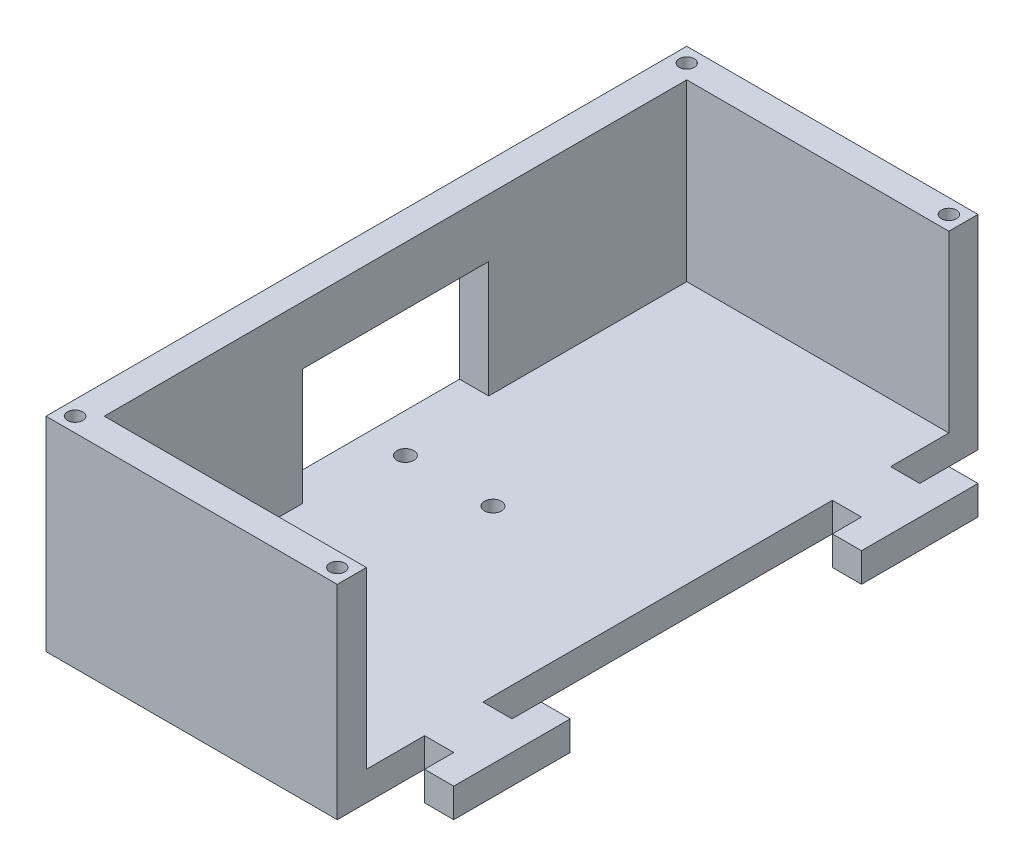
ISO-10303-21;
HEADER;
FILE_DESCRIPTION(('STEP AP214'),'2;1');
FILE_NAME('part.step','',(''),(''),'','','');
FILE_SCHEMA(('AUTOMOTIVE_DESIGN { 1 0 10303 214 1 1 1 1 }'));
ENDSEC;
DATA;
#1=APPLICATION_CONTEXT('core data for automotive mechanical design processes');
#2=APPLICATION_PROTOCOL_DEFINITION('international standard','automotive_design',2000,#1);
#3=PRODUCT_CONTEXT('',#1,'mechanical');
#4=PRODUCT('Part','Part','',(#3));
#5=PRODUCT_RELATED_PRODUCT_CATEGORY('part','',(#4));
#6=PRODUCT_DEFINITION_FORMATION('','',#4);
#7=PRODUCT_DEFINITION_CONTEXT('part definition',#1,'design');
#8=PRODUCT_DEFINITION('design','',#6,#7);
#9=PRODUCT_DEFINITION_SHAPE('','',#8);
#10=(LENGTH_UNIT() NAMED_UNIT(*) SI_UNIT(.MILLI.,.METRE.));
#11=(NAMED_UNIT(*) PLANE_ANGLE_UNIT() SI_UNIT($,.RADIAN.));
#12=(NAMED_UNIT(*) SI_UNIT($,.STERADIAN.) SOLID_ANGLE_UNIT());
#13=UNCERTAINTY_MEASURE_WITH_UNIT(LENGTH_MEASURE(1.E-05),#10,'distance_accuracy_value','');
#14=(GEOMETRIC_REPRESENTATION_CONTEXT(3) GLOBAL_UNCERTAINTY_ASSIGNED_CONTEXT((#13)) GLOBAL_UNIT_ASSIGNED_CONTEXT((#10,
#11,#12)) REPRESENTATION_CONTEXT('',''));
#15=CARTESIAN_POINT('',(0.,0.,0.));
#16=DIRECTION('',(0.,0.,1.));
#17=DIRECTION('',(1.,0.,0.));
#18=AXIS2_PLACEMENT_3D('',#15,#16,#17);
#19=CARTESIAN_POINT('',(0.,6.35,0.));
#20=DIRECTION('',(0.,-1.,0.));
#21=DIRECTION('',(0.,0.,-1.));
#22=AXIS2_PLACEMENT_3D('',#19,#20,#21);
#23=PLANE('',#22);
#24=CARTESIAN_POINT('',(-10.5,6.35,0.));
#25=DIRECTION('',(0.,-1.,0.));
#26=DIRECTION('',(0.,0.,-1.));
#27=AXIS2_PLACEMENT_3D('',#24,#25,#26);
#28=CIRCLE('',#27,1.85000000000003);
#29=CARTESIAN_POINT('',(-10.5,6.35,-1.85000000000002));
#30=VERTEX_POINT('',#29);
#31=EDGE_CURVE('E292',#30,#30,#28,.T.);
#32=ORIENTED_EDGE('',*,*,#31,.T.);
#33=EDGE_LOOP('',(#32));
#34=FACE_BOUND('',#33,.T.);
#35=CARTESIAN_POINT('',(-29.6,6.35,0.));
#36=DIRECTION('',(0.,-1.,0.));
#37=DIRECTION('',(0.,0.,-1.));
#38=AXIS2_PLACEMENT_3D('',#35,#36,#37);
#39=CIRCLE('',#38,1.85000000000003);
#40=CARTESIAN_POINT('',(-29.6,6.35,-1.85000000000002));
#41=VERTEX_POINT('',#40);
#42=EDGE_CURVE('E285',#41,#41,#39,.T.);
#43=ORIENTED_EDGE('',*,*,#42,.T.);
#44=EDGE_LOOP('',(#43));
#45=FACE_BOUND('',#44,.T.);
#46=DIRECTION('',(0.,0.,-1.));
#47=VECTOR('',#46,1.);
#48=CARTESIAN_POINT('',(-31.75,6.35,-63.5));
#49=LINE('',#48,#47);
#50=CARTESIAN_POINT('',(-31.75,6.35,-20.32));
#51=VERTEX_POINT('',#50);
#52=CARTESIAN_POINT('',(-31.75,6.35,-63.5));
#53=VERTEX_POINT('',#52);
#54=EDGE_CURVE('E586',#51,#53,#49,.T.);
#55=ORIENTED_EDGE('',*,*,#54,.F.);
#56=DIRECTION('',(1.,0.,0.));
#57=VECTOR('',#56,1.);
#58=CARTESIAN_POINT('',(-38.1,6.35,-20.32));
#59=LINE('',#58,#57);
#60=CARTESIAN_POINT('',(-38.1,6.35,-20.32));
#61=VERTEX_POINT('',#60);
#62=EDGE_CURVE('E280',#61,#51,#59,.T.);
#63=ORIENTED_EDGE('',*,*,#62,.F.);
#64=DIRECTION('',(0.,0.,1.));
#65=VECTOR('',#64,1.);
#66=CARTESIAN_POINT('',(-38.1,6.35,69.85));
#67=LINE('',#66,#65);
#68=CARTESIAN_POINT('',(-38.1,6.35,20.32));
#69=VERTEX_POINT('',#68);
#70=EDGE_CURVE('E252',#61,#69,#67,.T.);
#71=ORIENTED_EDGE('',*,*,#70,.T.);
#72=DIRECTION('',(-1.,0.,0.));
#73=VECTOR('',#72,1.);
#74=CARTESIAN_POINT('',(-38.1,6.35,20.32));
#75=LINE('',#74,#73);
#76=CARTESIAN_POINT('',(-31.75,6.35,20.32));
#77=VERTEX_POINT('',#76);
#78=EDGE_CURVE('E273',#77,#69,#75,.T.);
#79=ORIENTED_EDGE('',*,*,#78,.F.);
#80=DIRECTION('',(0.,0.,-1.));
#81=VECTOR('',#80,1.);
#82=CARTESIAN_POINT('',(-31.75,6.35,63.5));
#83=LINE('',#82,#81);
#84=CARTESIAN_POINT('',(-31.75,6.35,63.5));
#85=VERTEX_POINT('',#84);
#86=EDGE_CURVE('E276',#85,#77,#83,.T.);
#87=ORIENTED_EDGE('',*,*,#86,.F.);
#88=DIRECTION('',(-1.,0.,0.));
#89=VECTOR('',#88,1.);
#90=CARTESIAN_POINT('',(-38.1,6.35,63.5));
#91=LINE('',#90,#89);
#92=CARTESIAN_POINT('',(25.4,6.35,63.5));
#93=VERTEX_POINT('',#92);
#94=EDGE_CURVE('E476',#93,#85,#91,.T.);
#95=ORIENTED_EDGE('',*,*,#94,.F.);
#96=DIRECTION('',(0.,0.,-1.));
#97=VECTOR('',#96,1.);
#98=CARTESIAN_POINT('',(25.4,6.35,69.85));
#99=LINE('',#98,#97);
#100=CARTESIAN_POINT('',(25.4,6.35,50.8));
#101=VERTEX_POINT('',#100);
#102=EDGE_CURVE('E498',#93,#101,#99,.T.);
#103=ORIENTED_EDGE('',*,*,#102,.T.);
#104=DIRECTION('',(-1.,0.,0.));
#105=VECTOR('',#104,1.);
#106=CARTESIAN_POINT('',(25.4,6.35,50.8));
#107=LINE('',#106,#105);
#108=CARTESIAN_POINT('',(31.75,6.35,50.8));
#109=VERTEX_POINT('',#108);
#110=EDGE_CURVE('E328',#109,#101,#107,.T.);
#111=ORIENTED_EDGE('',*,*,#110,.F.);
#112=DIRECTION('',(0.,0.,-1.));
#113=VECTOR('',#112,1.);
#114=CARTESIAN_POINT('',(31.75,6.35,57.15));
#115=LINE('',#114,#113);
#116=CARTESIAN_POINT('',(31.75,6.35,57.15));
#117=VERTEX_POINT('',#116);
#118=EDGE_CURVE('E323',#117,#109,#115,.T.);
#119=ORIENTED_EDGE('',*,*,#118,.F.);
#120=DIRECTION('',(-1.,0.,0.));
#121=VECTOR('',#120,1.);
#122=CARTESIAN_POINT('',(31.75,6.35,57.15));
#123=LINE('',#122,#121);
#124=CARTESIAN_POINT('',(38.1,6.35,57.15));
#125=VERTEX_POINT('',#124);
#126=EDGE_CURVE('E318',#125,#117,#123,.T.);
#127=ORIENTED_EDGE('',*,*,#126,.F.);
#128=DIRECTION('',(0.,0.,1.));
#129=VECTOR('',#128,1.);
#130=CARTESIAN_POINT('',(38.1,6.35,57.15));
#131=LINE('',#130,#129);
#132=CARTESIAN_POINT('',(38.1,6.35,31.75));
#133=VERTEX_POINT('',#132);
#134=EDGE_CURVE('E313',#133,#125,#131,.T.);
#135=ORIENTED_EDGE('',*,*,#134,.F.);
#136=DIRECTION('',(1.,0.,0.));
#137=VECTOR('',#136,1.);
#138=CARTESIAN_POINT('',(31.75,6.35,31.75));
#139=LINE('',#138,#137);
#140=CARTESIAN_POINT('',(31.75,6.35,31.75));
#141=VERTEX_POINT('',#140);
#142=EDGE_CURVE('E308',#141,#133,#139,.T.);
#143=ORIENTED_EDGE('',*,*,#142,.F.);
#144=DIRECTION('',(0.,0.,-1.));
#145=VECTOR('',#144,1.);
#146=CARTESIAN_POINT('',(31.75,6.35,38.1));
#147=LINE('',#146,#145);
#148=CARTESIAN_POINT('',(31.75,6.35,38.1));
#149=VERTEX_POINT('',#148);
#150=EDGE_CURVE('E303',#149,#141,#147,.T.);
#151=ORIENTED_EDGE('',*,*,#150,.F.);
#152=DIRECTION('',(1.,0.,0.));
#153=VECTOR('',#152,1.);
#154=CARTESIAN_POINT('',(25.4,6.35,38.1));
#155=LINE('',#154,#153);
#156=CARTESIAN_POINT('',(25.4,6.35,38.1));
#157=VERTEX_POINT('',#156);
#158=EDGE_CURVE('E297',#157,#149,#155,.T.);
#159=ORIENTED_EDGE('',*,*,#158,.F.);
#160=CARTESIAN_POINT('',(25.4,6.35,-38.1));
#161=VERTEX_POINT('',#160);
#162=EDGE_CURVE('E502',#157,#161,#99,.T.);
#163=ORIENTED_EDGE('',*,*,#162,.T.);
#164=DIRECTION('',(1.,0.,0.));
#165=VECTOR('',#164,1.);
#166=CARTESIAN_POINT('',(25.4,6.35,-38.1));
#167=LINE('',#166,#165);
#168=CARTESIAN_POINT('',(31.75,6.35,-38.1));
#169=VERTEX_POINT('',#168);
#170=EDGE_CURVE('E337',#161,#169,#167,.T.);
#171=ORIENTED_EDGE('',*,*,#170,.T.);
#172=DIRECTION('',(0.,0.,1.));
#173=VECTOR('',#172,1.);
#174=CARTESIAN_POINT('',(31.75,6.35,-38.1));
#175=LINE('',#174,#173);
#176=CARTESIAN_POINT('',(31.75,6.35,-31.75));
#177=VERTEX_POINT('',#176);
#178=EDGE_CURVE('E399',#169,#177,#175,.T.);
#179=ORIENTED_EDGE('',*,*,#178,.T.);
#180=DIRECTION('',(1.,0.,0.));
#181=VECTOR('',#180,1.);
#182=CARTESIAN_POINT('',(31.75,6.35,-31.75));
#183=LINE('',#182,#181);
#184=CARTESIAN_POINT('',(38.1,6.35,-31.75));
#185=VERTEX_POINT('',#184);
#186=EDGE_CURVE('E395',#177,#185,#183,.T.);
#187=ORIENTED_EDGE('',*,*,#186,.T.);
#188=DIRECTION('',(0.,0.,-1.));
#189=VECTOR('',#188,1.);
#190=CARTESIAN_POINT('',(38.1,6.35,-57.15));
#191=LINE('',#190,#189);
#192=CARTESIAN_POINT('',(38.1,6.35,-57.15));
#193=VERTEX_POINT('',#192);
#194=EDGE_CURVE('E391',#185,#193,#191,.T.);
#195=ORIENTED_EDGE('',*,*,#194,.T.);
#196=DIRECTION('',(-1.,0.,0.));
#197=VECTOR('',#196,1.);
#198=CARTESIAN_POINT('',(31.75,6.35,-57.15));
#199=LINE('',#198,#197);
#200=CARTESIAN_POINT('',(31.75,6.35,-57.15));
#201=VERTEX_POINT('',#200);
#202=EDGE_CURVE('E387',#193,#201,#199,.T.);
#203=ORIENTED_EDGE('',*,*,#202,.T.);
#204=DIRECTION('',(0.,0.,1.));
#205=VECTOR('',#204,1.);
#206=CARTESIAN_POINT('',(31.75,6.35,-57.15));
#207=LINE('',#206,#205);
#208=CARTESIAN_POINT('',(31.75,6.35,-50.8));
#209=VERTEX_POINT('',#208);
#210=EDGE_CURVE('E383',#201,#209,#207,.T.);
#211=ORIENTED_EDGE('',*,*,#210,.T.);
#212=DIRECTION('',(-1.,0.,0.));
#213=VECTOR('',#212,1.);
#214=CARTESIAN_POINT('',(25.4,6.35,-50.8));
#215=LINE('',#214,#213);
#216=CARTESIAN_POINT('',(25.4,6.35,-50.8));
#217=VERTEX_POINT('',#216);
#218=EDGE_CURVE('E378',#209,#217,#215,.T.);
#219=ORIENTED_EDGE('',*,*,#218,.T.);
#220=CARTESIAN_POINT('',(25.4,6.35,-63.5));
#221=VERTEX_POINT('',#220);
#222=EDGE_CURVE('E503',#217,#221,#99,.T.);
#223=ORIENTED_EDGE('',*,*,#222,.T.);
#224=DIRECTION('',(1.,0.,0.));
#225=VECTOR('',#224,1.);
#226=CARTESIAN_POINT('',(-38.1,6.35,-63.5));
#227=LINE('',#226,#225);
#228=EDGE_CURVE('E462',#53,#221,#227,.T.);
#229=ORIENTED_EDGE('',*,*,#228,.F.);
#230=EDGE_LOOP('',(#55,#63,#71,#79,#87,#95,#103,#111,#119,#127,#135,#143,#151,#159,#163,#171,
#179,#187,#195,#203,#211,#219,#223,#229));
#231=FACE_BOUND('',#230,.T.);
#232=ADVANCED_FACE('F45',(#34,#45,#231),#23,.F.);
#233=CARTESIAN_POINT('',(-38.1,44.45,63.5));
#234=DIRECTION('',(0.,0.,1.));
#235=DIRECTION('',(1.,0.,0.));
#236=AXIS2_PLACEMENT_3D('',#233,#234,#235);
#237=PLANE('',#236);
#238=DIRECTION('',(0.,-1.,0.));
#239=VECTOR('',#238,1.);
#240=CARTESIAN_POINT('',(-31.75,88.0944143046966,63.5));
#241=LINE('',#240,#239);
#242=CARTESIAN_POINT('',(-31.75,44.45,63.5));
#243=VERTEX_POINT('',#242);
#244=EDGE_CURVE('E264',#243,#85,#241,.T.);
#245=ORIENTED_EDGE('',*,*,#244,.F.);
#246=DIRECTION('',(-1.,0.,0.));
#247=VECTOR('',#246,1.);
#248=CARTESIAN_POINT('',(-38.1,44.45,63.5));
#249=LINE('',#248,#247);
#250=CARTESIAN_POINT('',(25.4,44.45,63.5));
#251=VERTEX_POINT('',#250);
#252=EDGE_CURVE('E484',#251,#243,#249,.T.);
#253=ORIENTED_EDGE('',*,*,#252,.F.);
#254=DIRECTION('',(0.,-1.,0.));
#255=VECTOR('',#254,1.);
#256=CARTESIAN_POINT('',(25.4,44.45,63.5));
#257=LINE('',#256,#255);
#258=EDGE_CURVE('E457',#251,#93,#257,.T.);
#259=ORIENTED_EDGE('',*,*,#258,.T.);
#260=ORIENTED_EDGE('',*,*,#94,.T.);
#261=EDGE_LOOP('',(#245,#253,#259,#260));
#262=FACE_BOUND('',#261,.T.);
#263=ADVANCED_FACE('F662',(#262),#237,.F.);
#264=CARTESIAN_POINT('',(-38.1,44.45,-63.5));
#265=DIRECTION('',(0.,0.,-1.));
#266=DIRECTION('',(-1.,0.,0.));
#267=AXIS2_PLACEMENT_3D('',#264,#265,#266);
#268=PLANE('',#267);
#269=DIRECTION('',(0.,-1.,0.));
#270=VECTOR('',#269,1.);
#271=CARTESIAN_POINT('',(-31.75,88.0944143046966,-63.5));
#272=LINE('',#271,#270);
#273=CARTESIAN_POINT('',(-31.75,44.45,-63.5));
#274=VERTEX_POINT('',#273);
#275=EDGE_CURVE('E260',#274,#53,#272,.T.);
#276=ORIENTED_EDGE('',*,*,#275,.T.);
#277=ORIENTED_EDGE('',*,*,#228,.T.);
#278=DIRECTION('',(0.,-1.,0.));
#279=VECTOR('',#278,1.);
#280=CARTESIAN_POINT('',(25.4,44.45,-63.5));
#281=LINE('',#280,#279);
#282=CARTESIAN_POINT('',(25.4,44.45,-63.5));
#283=VERTEX_POINT('',#282);
#284=EDGE_CURVE('E473',#283,#221,#281,.T.);
#285=ORIENTED_EDGE('',*,*,#284,.F.);
#286=DIRECTION('',(1.,0.,0.));
#287=VECTOR('',#286,1.);
#288=CARTESIAN_POINT('',(-38.1,44.45,-63.5));
#289=LINE('',#288,#287);
#290=EDGE_CURVE('E461',#274,#283,#289,.T.);
#291=ORIENTED_EDGE('',*,*,#290,.F.);
#292=EDGE_LOOP('',(#276,#277,#285,#291));
#293=FACE_BOUND('',#292,.T.);
#294=ADVANCED_FACE('F583',(#293),#268,.F.);
#295=CARTESIAN_POINT('',(25.4,6.35,69.85));
#296=DIRECTION('',(-1.,0.,0.));
#297=DIRECTION('',(0.,0.,1.));
#298=AXIS2_PLACEMENT_3D('',#295,#296,#297);
#299=PLANE('',#298);
#300=DIRECTION('',(0.,1.,0.));
#301=VECTOR('',#300,1.);
#302=CARTESIAN_POINT('',(25.4,-28.3980633142473,38.1));
#303=LINE('',#302,#301);
#304=CARTESIAN_POINT('',(25.4,0.,38.1));
#305=VERTEX_POINT('',#304);
#306=EDGE_CURVE('E302',#305,#157,#303,.T.);
#307=ORIENTED_EDGE('',*,*,#306,.F.);
#308=DIRECTION('',(0.,0.,-1.));
#309=VECTOR('',#308,1.);
#310=CARTESIAN_POINT('',(25.4,0.,69.85));
#311=LINE('',#310,#309);
#312=CARTESIAN_POINT('',(25.4,0.,-38.1));
#313=VERTEX_POINT('',#312);
#314=EDGE_CURVE('E511',#305,#313,#311,.T.);
#315=ORIENTED_EDGE('',*,*,#314,.T.);
#316=DIRECTION('',(0.,1.,0.));
#317=VECTOR('',#316,1.);
#318=CARTESIAN_POINT('',(25.4,-28.3980633142473,-38.1));
#319=LINE('',#318,#317);
#320=EDGE_CURVE('E441',#313,#161,#319,.T.);
#321=ORIENTED_EDGE('',*,*,#320,.T.);
#322=ORIENTED_EDGE('',*,*,#162,.F.);
#323=EDGE_LOOP('',(#307,#315,#321,#322));
#324=FACE_BOUND('',#323,.T.);
#325=ADVANCED_FACE('F47',(#324),#299,.F.);
#326=DIRECTION('',(0.,1.,0.));
#327=VECTOR('',#326,1.);
#328=CARTESIAN_POINT('',(25.4,-28.3980633142473,50.8));
#329=LINE('',#328,#327);
#330=CARTESIAN_POINT('',(25.4,0.,50.8));
#331=VERTEX_POINT('',#330);
#332=EDGE_CURVE('E296',#331,#101,#329,.T.);
#333=ORIENTED_EDGE('',*,*,#332,.T.);
#334=ORIENTED_EDGE('',*,*,#102,.F.);
#335=ORIENTED_EDGE('',*,*,#258,.F.);
#336=DIRECTION('',(0.,0.,-1.));
#337=VECTOR('',#336,1.);
#338=CARTESIAN_POINT('',(25.4,44.45,69.85));
#339=LINE('',#338,#337);
#340=CARTESIAN_POINT('',(25.4,44.45,69.85));
#341=VERTEX_POINT('',#340);
#342=EDGE_CURVE('E492',#341,#251,#339,.T.);
#343=ORIENTED_EDGE('',*,*,#342,.F.);
#344=DIRECTION('',(0.,-1.,0.));
#345=VECTOR('',#344,1.);
#346=CARTESIAN_POINT('',(25.4,6.35,69.85));
#347=LINE('',#346,#345);
#348=CARTESIAN_POINT('',(25.4,0.,69.85));
#349=VERTEX_POINT('',#348);
#350=EDGE_CURVE('E506',#341,#349,#347,.T.);
#351=ORIENTED_EDGE('',*,*,#350,.T.);
#352=EDGE_CURVE('E507',#349,#331,#311,.T.);
#353=ORIENTED_EDGE('',*,*,#352,.T.);
#354=EDGE_LOOP('',(#333,#334,#335,#343,#351,#353));
#355=FACE_BOUND('',#354,.T.);
#356=ADVANCED_FACE('F544',(#355),#299,.F.);
#357=DIRECTION('',(0.,1.,0.));
#358=VECTOR('',#357,1.);
#359=CARTESIAN_POINT('',(25.4,-28.3980633142473,-50.8));
#360=LINE('',#359,#358);
#361=CARTESIAN_POINT('',(25.4,0.,-50.8));
#362=VERTEX_POINT('',#361);
#363=EDGE_CURVE('E413',#362,#217,#360,.T.);
#364=ORIENTED_EDGE('',*,*,#363,.F.);
#365=CARTESIAN_POINT('',(25.4,0.,-69.85));
#366=VERTEX_POINT('',#365);
#367=EDGE_CURVE('E480',#362,#366,#311,.T.);
#368=ORIENTED_EDGE('',*,*,#367,.T.);
#369=DIRECTION('',(0.,-1.,0.));
#370=VECTOR('',#369,1.);
#371=CARTESIAN_POINT('',(25.4,6.35,-69.85));
#372=LINE('',#371,#370);
#373=CARTESIAN_POINT('',(25.4,44.45,-69.85));
#374=VERTEX_POINT('',#373);
#375=EDGE_CURVE('E11',#374,#366,#372,.T.);
#376=ORIENTED_EDGE('',*,*,#375,.F.);
#377=DIRECTION('',(0.,0.,-1.));
#378=VECTOR('',#377,1.);
#379=CARTESIAN_POINT('',(25.4,44.45,-69.85));
#380=LINE('',#379,#378);
#381=EDGE_CURVE('E465',#283,#374,#380,.T.);
#382=ORIENTED_EDGE('',*,*,#381,.F.);
#383=ORIENTED_EDGE('',*,*,#284,.T.);
#384=ORIENTED_EDGE('',*,*,#222,.F.);
#385=EDGE_LOOP('',(#364,#368,#376,#382,#383,#384));
#386=FACE_BOUND('',#385,.T.);
#387=ADVANCED_FACE('F556',(#386),#299,.F.);
#388=CARTESIAN_POINT('',(-38.1,6.35,-69.85));
#389=DIRECTION('',(0.,0.,1.));
#390=DIRECTION('',(1.,0.,0.));
#391=AXIS2_PLACEMENT_3D('',#388,#389,#390);
#392=PLANE('',#391);
#393=DIRECTION('',(-1.,0.,0.));
#394=VECTOR('',#393,1.);
#395=CARTESIAN_POINT('',(-38.1,0.,-69.85));
#396=LINE('',#395,#394);
#397=CARTESIAN_POINT('',(-38.1,0.,-69.85));
#398=VERTEX_POINT('',#397);
#399=EDGE_CURVE('E510',#366,#398,#396,.T.);
#400=ORIENTED_EDGE('',*,*,#399,.T.);
#401=DIRECTION('',(0.,-1.,0.));
#402=VECTOR('',#401,1.);
#403=CARTESIAN_POINT('',(-38.1,6.35,-69.85));
#404=LINE('',#403,#402);
#405=CARTESIAN_POINT('',(-38.1,44.45,-69.85));
#406=VERTEX_POINT('',#405);
#407=EDGE_CURVE('E54',#406,#398,#404,.T.);
#408=ORIENTED_EDGE('',*,*,#407,.F.);
#409=DIRECTION('',(-1.,0.,0.));
#410=VECTOR('',#409,1.);
#411=CARTESIAN_POINT('',(-38.1,44.45,-69.85));
#412=LINE('',#411,#410);
#413=EDGE_CURVE('E469',#374,#406,#412,.T.);
#414=ORIENTED_EDGE('',*,*,#413,.F.);
#415=ORIENTED_EDGE('',*,*,#375,.T.);
#416=EDGE_LOOP('',(#400,#408,#414,#415));
#417=FACE_BOUND('',#416,.T.);
#418=ADVANCED_FACE('F553',(#417),#392,.F.);
#419=CARTESIAN_POINT('',(-38.1,6.35,69.85));
#420=DIRECTION('',(1.,0.,0.));
#421=DIRECTION('',(0.,0.,-1.));
#422=AXIS2_PLACEMENT_3D('',#419,#420,#421);
#423=PLANE('',#422);
#424=DIRECTION('',(0.,-1.,0.));
#425=VECTOR('',#424,1.);
#426=CARTESIAN_POINT('',(-38.1,88.0944143046966,-20.32));
#427=LINE('',#426,#425);
#428=CARTESIAN_POINT('',(-38.1,31.75,-20.32));
#429=VERTEX_POINT('',#428);
#430=EDGE_CURVE('E243',#429,#61,#427,.T.);
#431=ORIENTED_EDGE('',*,*,#430,.F.);
#432=DIRECTION('',(0.,0.,1.));
#433=VECTOR('',#432,1.);
#434=CARTESIAN_POINT('',(-38.1,31.75,-20.32));
#435=LINE('',#434,#433);
#436=CARTESIAN_POINT('',(-38.1,31.75,20.32));
#437=VERTEX_POINT('',#436);
#438=EDGE_CURVE('E231',#429,#437,#435,.T.);
#439=ORIENTED_EDGE('',*,*,#438,.T.);
#440=DIRECTION('',(0.,-1.,0.));
#441=VECTOR('',#440,1.);
#442=CARTESIAN_POINT('',(-38.1,88.0944143046966,20.32));
#443=LINE('',#442,#441);
#444=EDGE_CURVE('E69',#437,#69,#443,.T.);
#445=ORIENTED_EDGE('',*,*,#444,.T.);
#446=ORIENTED_EDGE('',*,*,#70,.F.);
#447=EDGE_LOOP('',(#431,#439,#445,#446));
#448=FACE_BOUND('',#447,.T.);
#449=DIRECTION('',(0.,-1.,0.));
#450=VECTOR('',#449,1.);
#451=CARTESIAN_POINT('',(-38.1,6.35,69.85));
#452=LINE('',#451,#450);
#453=CARTESIAN_POINT('',(-38.1,44.45,69.85));
#454=VERTEX_POINT('',#453);
#455=CARTESIAN_POINT('',(-38.1,0.,69.85));
#456=VERTEX_POINT('',#455);
#457=EDGE_CURVE('E523',#454,#456,#452,.T.);
#458=ORIENTED_EDGE('',*,*,#457,.F.);
#459=DIRECTION('',(0.,0.,1.));
#460=VECTOR('',#459,1.);
#461=CARTESIAN_POINT('',(-38.1,44.45,-69.85));
#462=LINE('',#461,#460);
#463=EDGE_CURVE('E458',#406,#454,#462,.T.);
#464=ORIENTED_EDGE('',*,*,#463,.F.);
#465=ORIENTED_EDGE('',*,*,#407,.T.);
#466=DIRECTION('',(0.,0.,1.));
#467=VECTOR('',#466,1.);
#468=CARTESIAN_POINT('',(-38.1,0.,69.85));
#469=LINE('',#468,#467);
#470=EDGE_CURVE('E514',#398,#456,#469,.T.);
#471=ORIENTED_EDGE('',*,*,#470,.T.);
#472=EDGE_LOOP('',(#458,#464,#465,#471));
#473=FACE_BOUND('',#472,.T.);
#474=ADVANCED_FACE('F249',(#448,#473),#423,.F.);
#475=CARTESIAN_POINT('',(-38.1,6.35,69.85));
#476=DIRECTION('',(0.,0.,-1.));
#477=DIRECTION('',(-1.,0.,0.));
#478=AXIS2_PLACEMENT_3D('',#475,#476,#477);
#479=PLANE('',#478);
#480=DIRECTION('',(1.,0.,0.));
#481=VECTOR('',#480,1.);
#482=CARTESIAN_POINT('',(-38.1,0.,69.85));
#483=LINE('',#482,#481);
#484=EDGE_CURVE('E517',#456,#349,#483,.T.);
#485=ORIENTED_EDGE('',*,*,#484,.T.);
#486=ORIENTED_EDGE('',*,*,#350,.F.);
#487=DIRECTION('',(1.,0.,0.));
#488=VECTOR('',#487,1.);
#489=CARTESIAN_POINT('',(-38.1,44.45,69.85));
#490=LINE('',#489,#488);
#491=EDGE_CURVE('E488',#454,#341,#490,.T.);
#492=ORIENTED_EDGE('',*,*,#491,.F.);
#493=ORIENTED_EDGE('',*,*,#457,.T.);
#494=EDGE_LOOP('',(#485,#486,#492,#493));
#495=FACE_BOUND('',#494,.T.);
#496=ADVANCED_FACE('F540',(#495),#479,.F.);
#497=CARTESIAN_POINT('',(0.,0.,0.));
#498=DIRECTION('',(0.,-1.,0.));
#499=DIRECTION('',(0.,0.,-1.));
#500=AXIS2_PLACEMENT_3D('',#497,#498,#499);
#501=PLANE('',#500);
#502=CARTESIAN_POINT('',(-10.5,0.,0.));
#503=DIRECTION('',(0.,-1.,0.));
#504=DIRECTION('',(0.,0.,-1.));
#505=AXIS2_PLACEMENT_3D('',#502,#503,#504);
#506=CIRCLE('',#505,1.85000000000003);
#507=CARTESIAN_POINT('',(-10.5,0.,-1.85000000000002));
#508=VERTEX_POINT('',#507);
#509=EDGE_CURVE('E281',#508,#508,#506,.T.);
#510=ORIENTED_EDGE('',*,*,#509,.F.);
#511=EDGE_LOOP('',(#510));
#512=FACE_BOUND('',#511,.T.);
#513=CARTESIAN_POINT('',(-29.6,0.,0.));
#514=DIRECTION('',(0.,-1.,0.));
#515=DIRECTION('',(0.,0.,-1.));
#516=AXIS2_PLACEMENT_3D('',#513,#514,#515);
#517=CIRCLE('',#516,1.85000000000003);
#518=CARTESIAN_POINT('',(-29.6,0.,-1.85000000000002));
#519=VERTEX_POINT('',#518);
#520=EDGE_CURVE('E258',#519,#519,#517,.T.);
#521=ORIENTED_EDGE('',*,*,#520,.F.);
#522=EDGE_LOOP('',(#521));
#523=FACE_BOUND('',#522,.T.);
#524=ORIENTED_EDGE('',*,*,#352,.F.);
#525=ORIENTED_EDGE('',*,*,#484,.F.);
#526=ORIENTED_EDGE('',*,*,#470,.F.);
#527=ORIENTED_EDGE('',*,*,#399,.F.);
#528=ORIENTED_EDGE('',*,*,#367,.F.);
#529=DIRECTION('',(-1.,0.,0.));
#530=VECTOR('',#529,1.);
#531=CARTESIAN_POINT('',(25.4,0.,-50.8));
#532=LINE('',#531,#530);
#533=CARTESIAN_POINT('',(31.75,0.,-50.8));
#534=VERTEX_POINT('',#533);
#535=EDGE_CURVE('E410',#534,#362,#532,.T.);
#536=ORIENTED_EDGE('',*,*,#535,.F.);
#537=DIRECTION('',(0.,0.,1.));
#538=VECTOR('',#537,1.);
#539=CARTESIAN_POINT('',(31.75,0.,-57.15));
#540=LINE('',#539,#538);
#541=CARTESIAN_POINT('',(31.75,0.,-57.15));
#542=VERTEX_POINT('',#541);
#543=EDGE_CURVE('E415',#542,#534,#540,.T.);
#544=ORIENTED_EDGE('',*,*,#543,.F.);
#545=DIRECTION('',(-1.,0.,0.));
#546=VECTOR('',#545,1.);
#547=CARTESIAN_POINT('',(31.75,0.,-57.15));
#548=LINE('',#547,#546);
#549=CARTESIAN_POINT('',(38.1,0.,-57.15));
#550=VERTEX_POINT('',#549);
#551=EDGE_CURVE('E420',#550,#542,#548,.T.);
#552=ORIENTED_EDGE('',*,*,#551,.F.);
#553=DIRECTION('',(0.,0.,-1.));
#554=VECTOR('',#553,1.);
#555=CARTESIAN_POINT('',(38.1,0.,-57.15));
#556=LINE('',#555,#554);
#557=CARTESIAN_POINT('',(38.1,0.,-31.75));
#558=VERTEX_POINT('',#557);
#559=EDGE_CURVE('E425',#558,#550,#556,.T.);
#560=ORIENTED_EDGE('',*,*,#559,.F.);
#561=DIRECTION('',(1.,0.,0.));
#562=VECTOR('',#561,1.);
#563=CARTESIAN_POINT('',(31.75,0.,-31.75));
#564=LINE('',#563,#562);
#565=CARTESIAN_POINT('',(31.75,0.,-31.75));
#566=VERTEX_POINT('',#565);
#567=EDGE_CURVE('E430',#566,#558,#564,.T.);
#568=ORIENTED_EDGE('',*,*,#567,.F.);
#569=DIRECTION('',(0.,0.,1.));
#570=VECTOR('',#569,1.);
#571=CARTESIAN_POINT('',(31.75,0.,-38.1));
#572=LINE('',#571,#570);
#573=CARTESIAN_POINT('',(31.75,0.,-38.1));
#574=VERTEX_POINT('',#573);
#575=EDGE_CURVE('E435',#574,#566,#572,.T.);
#576=ORIENTED_EDGE('',*,*,#575,.F.);
#577=DIRECTION('',(1.,0.,0.));
#578=VECTOR('',#577,1.);
#579=CARTESIAN_POINT('',(25.4,0.,-38.1));
#580=LINE('',#579,#578);
#581=EDGE_CURVE('E382',#313,#574,#580,.T.);
#582=ORIENTED_EDGE('',*,*,#581,.F.);
#583=ORIENTED_EDGE('',*,*,#314,.F.);
#584=DIRECTION('',(1.,0.,0.));
#585=VECTOR('',#584,1.);
#586=CARTESIAN_POINT('',(25.4,0.,38.1));
#587=LINE('',#586,#585);
#588=CARTESIAN_POINT('',(31.75,0.,38.1));
#589=VERTEX_POINT('',#588);
#590=EDGE_CURVE('E354',#305,#589,#587,.T.);
#591=ORIENTED_EDGE('',*,*,#590,.T.);
#592=DIRECTION('',(0.,0.,-1.));
#593=VECTOR('',#592,1.);
#594=CARTESIAN_POINT('',(31.75,0.,38.1));
#595=LINE('',#594,#593);
#596=CARTESIAN_POINT('',(31.75,0.,31.75));
#597=VERTEX_POINT('',#596);
#598=EDGE_CURVE('E350',#589,#597,#595,.T.);
#599=ORIENTED_EDGE('',*,*,#598,.T.);
#600=DIRECTION('',(1.,0.,0.));
#601=VECTOR('',#600,1.);
#602=CARTESIAN_POINT('',(31.75,0.,31.75));
#603=LINE('',#602,#601);
#604=CARTESIAN_POINT('',(38.1,0.,31.75));
#605=VERTEX_POINT('',#604);
#606=EDGE_CURVE('E346',#597,#605,#603,.T.);
#607=ORIENTED_EDGE('',*,*,#606,.T.);
#608=DIRECTION('',(0.,0.,1.));
#609=VECTOR('',#608,1.);
#610=CARTESIAN_POINT('',(38.1,0.,57.15));
#611=LINE('',#610,#609);
#612=CARTESIAN_POINT('',(38.1,0.,57.15));
#613=VERTEX_POINT('',#612);
#614=EDGE_CURVE('E342',#605,#613,#611,.T.);
#615=ORIENTED_EDGE('',*,*,#614,.T.);
#616=DIRECTION('',(-1.,0.,0.));
#617=VECTOR('',#616,1.);
#618=CARTESIAN_POINT('',(31.75,0.,57.15));
#619=LINE('',#618,#617);
#620=CARTESIAN_POINT('',(31.75,0.,57.15));
#621=VERTEX_POINT('',#620);
#622=EDGE_CURVE('E338',#613,#621,#619,.T.);
#623=ORIENTED_EDGE('',*,*,#622,.T.);
#624=DIRECTION('',(0.,0.,-1.));
#625=VECTOR('',#624,1.);
#626=CARTESIAN_POINT('',(31.75,0.,57.15));
#627=LINE('',#626,#625);
#628=CARTESIAN_POINT('',(31.75,0.,50.8));
#629=VERTEX_POINT('',#628);
#630=EDGE_CURVE('E333',#621,#629,#627,.T.);
#631=ORIENTED_EDGE('',*,*,#630,.T.);
#632=DIRECTION('',(-1.,0.,0.));
#633=VECTOR('',#632,1.);
#634=CARTESIAN_POINT('',(25.4,0.,50.8));
#635=LINE('',#634,#633);
#636=EDGE_CURVE('E332',#629,#331,#635,.T.);
#637=ORIENTED_EDGE('',*,*,#636,.T.);
#638=EDGE_LOOP('',(#524,#525,#526,#527,#528,#536,#544,#552,#560,#568,#576,#582,#583,#591,#599,
#607,#615,#623,#631,#637));
#639=FACE_BOUND('',#638,.T.);
#640=ADVANCED_FACE('F537',(#512,#523,#639),#501,.T.);
#641=CARTESIAN_POINT('',(0.,44.45,0.));
#642=DIRECTION('',(0.,1.,0.));
#643=DIRECTION('',(0.,0.,1.));
#644=AXIS2_PLACEMENT_3D('',#641,#642,#643);
#645=PLANE('',#644);
#646=CARTESIAN_POINT('',(22.225,44.45,66.675));
#647=DIRECTION('',(0.,1.,0.));
#648=DIRECTION('',(0.,0.,-1.));
#649=AXIS2_PLACEMENT_3D('',#646,#647,#648);
#650=CIRCLE('',#649,1.65);
#651=CARTESIAN_POINT('',(22.225,44.45,65.025));
#652=VERTEX_POINT('',#651);
#653=EDGE_CURVE('E620',#652,#652,#650,.T.);
#654=ORIENTED_EDGE('',*,*,#653,.F.);
#655=EDGE_LOOP('',(#654));
#656=FACE_BOUND('',#655,.T.);
#657=CARTESIAN_POINT('',(22.225,44.45,-66.675));
#658=DIRECTION('',(0.,-1.,0.));
#659=DIRECTION('',(0.,0.,1.));
#660=AXIS2_PLACEMENT_3D('',#657,#658,#659);
#661=CIRCLE('',#660,1.65);
#662=CARTESIAN_POINT('',(22.225,44.45,-65.025));
#663=VERTEX_POINT('',#662);
#664=EDGE_CURVE('E612',#663,#663,#661,.T.);
#665=ORIENTED_EDGE('',*,*,#664,.T.);
#666=EDGE_LOOP('',(#665));
#667=FACE_BOUND('',#666,.T.);
#668=CARTESIAN_POINT('',(-34.925,44.45,66.675));
#669=DIRECTION('',(0.,-1.,0.));
#670=DIRECTION('',(0.,0.,-1.));
#671=AXIS2_PLACEMENT_3D('',#668,#669,#670);
#672=CIRCLE('',#671,1.65);
#673=CARTESIAN_POINT('',(-34.925,44.45,65.025));
#674=VERTEX_POINT('',#673);
#675=EDGE_CURVE('E604',#674,#674,#672,.T.);
#676=ORIENTED_EDGE('',*,*,#675,.T.);
#677=EDGE_LOOP('',(#676));
#678=FACE_BOUND('',#677,.T.);
#679=CARTESIAN_POINT('',(-34.925,44.45,-66.675));
#680=DIRECTION('',(0.,1.,0.));
#681=DIRECTION('',(0.,0.,1.));
#682=AXIS2_PLACEMENT_3D('',#679,#680,#681);
#683=CIRCLE('',#682,1.65);
#684=CARTESIAN_POINT('',(-34.925,44.45,-65.025));
#685=VERTEX_POINT('',#684);
#686=EDGE_CURVE('E596',#685,#685,#683,.T.);
#687=ORIENTED_EDGE('',*,*,#686,.F.);
#688=EDGE_LOOP('',(#687));
#689=FACE_BOUND('',#688,.T.);
#690=ORIENTED_EDGE('',*,*,#463,.T.);
#691=ORIENTED_EDGE('',*,*,#491,.T.);
#692=ORIENTED_EDGE('',*,*,#342,.T.);
#693=ORIENTED_EDGE('',*,*,#252,.T.);
#694=DIRECTION('',(0.,0.,1.));
#695=VECTOR('',#694,1.);
#696=CARTESIAN_POINT('',(-31.75,44.45,-63.5));
#697=LINE('',#696,#695);
#698=EDGE_CURVE('E254',#274,#243,#697,.T.);
#699=ORIENTED_EDGE('',*,*,#698,.F.);
#700=ORIENTED_EDGE('',*,*,#290,.T.);
#701=ORIENTED_EDGE('',*,*,#381,.T.);
#702=ORIENTED_EDGE('',*,*,#413,.T.);
#703=EDGE_LOOP('',(#690,#691,#692,#693,#699,#700,#701,#702));
#704=FACE_BOUND('',#703,.T.);
#705=ADVANCED_FACE('F550',(#656,#667,#678,#689,#704),#645,.T.);
#706=CARTESIAN_POINT('',(25.4,-28.3980633142473,-38.1));
#707=DIRECTION('',(0.,0.,1.));
#708=DIRECTION('',(1.,0.,0.));
#709=AXIS2_PLACEMENT_3D('',#706,#707,#708);
#710=PLANE('',#709);
#711=ORIENTED_EDGE('',*,*,#320,.F.);
#712=ORIENTED_EDGE('',*,*,#581,.T.);
#713=DIRECTION('',(0.,1.,0.));
#714=VECTOR('',#713,1.);
#715=CARTESIAN_POINT('',(31.75,-28.3980633142473,-38.1));
#716=LINE('',#715,#714);
#717=EDGE_CURVE('E409',#574,#169,#716,.T.);
#718=ORIENTED_EDGE('',*,*,#717,.T.);
#719=ORIENTED_EDGE('',*,*,#170,.F.);
#720=EDGE_LOOP('',(#711,#712,#718,#719));
#721=FACE_BOUND('',#720,.T.);
#722=ADVANCED_FACE('F568',(#721),#710,.T.);
#723=CARTESIAN_POINT('',(31.75,-28.3980633142473,-38.1));
#724=DIRECTION('',(-1.,0.,0.));
#725=DIRECTION('',(0.,0.,1.));
#726=AXIS2_PLACEMENT_3D('',#723,#724,#725);
#727=PLANE('',#726);
#728=ORIENTED_EDGE('',*,*,#717,.F.);
#729=ORIENTED_EDGE('',*,*,#575,.T.);
#730=DIRECTION('',(0.,1.,0.));
#731=VECTOR('',#730,1.);
#732=CARTESIAN_POINT('',(31.75,-28.3980633142473,-31.75));
#733=LINE('',#732,#731);
#734=EDGE_CURVE('E434',#566,#177,#733,.T.);
#735=ORIENTED_EDGE('',*,*,#734,.T.);
#736=ORIENTED_EDGE('',*,*,#178,.F.);
#737=EDGE_LOOP('',(#728,#729,#735,#736));
#738=FACE_BOUND('',#737,.T.);
#739=ADVANCED_FACE('F697',(#738),#727,.T.);
#740=CARTESIAN_POINT('',(31.75,-28.3980633142473,-31.75));
#741=DIRECTION('',(0.,0.,1.));
#742=DIRECTION('',(1.,0.,0.));
#743=AXIS2_PLACEMENT_3D('',#740,#741,#742);
#744=PLANE('',#743);
#745=ORIENTED_EDGE('',*,*,#734,.F.);
#746=ORIENTED_EDGE('',*,*,#567,.T.);
#747=DIRECTION('',(0.,1.,0.));
#748=VECTOR('',#747,1.);
#749=CARTESIAN_POINT('',(38.1,-28.3980633142473,-31.75));
#750=LINE('',#749,#748);
#751=EDGE_CURVE('E429',#558,#185,#750,.T.);
#752=ORIENTED_EDGE('',*,*,#751,.T.);
#753=ORIENTED_EDGE('',*,*,#186,.F.);
#754=EDGE_LOOP('',(#745,#746,#752,#753));
#755=FACE_BOUND('',#754,.T.);
#756=ADVANCED_FACE('F700',(#755),#744,.T.);
#757=CARTESIAN_POINT('',(38.1,-28.3980633142473,-57.15));
#758=DIRECTION('',(1.,0.,0.));
#759=DIRECTION('',(0.,0.,-1.));
#760=AXIS2_PLACEMENT_3D('',#757,#758,#759);
#761=PLANE('',#760);
#762=ORIENTED_EDGE('',*,*,#751,.F.);
#763=ORIENTED_EDGE('',*,*,#559,.T.);
#764=DIRECTION('',(0.,1.,0.));
#765=VECTOR('',#764,1.);
#766=CARTESIAN_POINT('',(38.1,-28.3980633142473,-57.15));
#767=LINE('',#766,#765);
#768=EDGE_CURVE('E424',#550,#193,#767,.T.);
#769=ORIENTED_EDGE('',*,*,#768,.T.);
#770=ORIENTED_EDGE('',*,*,#194,.F.);
#771=EDGE_LOOP('',(#762,#763,#769,#770));
#772=FACE_BOUND('',#771,.T.);
#773=ADVANCED_FACE('F704',(#772),#761,.T.);
#774=CARTESIAN_POINT('',(31.75,-28.3980633142473,-57.15));
#775=DIRECTION('',(0.,0.,-1.));
#776=DIRECTION('',(-1.,0.,0.));
#777=AXIS2_PLACEMENT_3D('',#774,#775,#776);
#778=PLANE('',#777);
#779=ORIENTED_EDGE('',*,*,#768,.F.);
#780=ORIENTED_EDGE('',*,*,#551,.T.);
#781=DIRECTION('',(0.,1.,0.));
#782=VECTOR('',#781,1.);
#783=CARTESIAN_POINT('',(31.75,-28.3980633142473,-57.15));
#784=LINE('',#783,#782);
#785=EDGE_CURVE('E419',#542,#201,#784,.T.);
#786=ORIENTED_EDGE('',*,*,#785,.T.);
#787=ORIENTED_EDGE('',*,*,#202,.F.);
#788=EDGE_LOOP('',(#779,#780,#786,#787));
#789=FACE_BOUND('',#788,.T.);
#790=ADVANCED_FACE('F708',(#789),#778,.T.);
#791=CARTESIAN_POINT('',(31.75,-28.3980633142473,-57.15));
#792=DIRECTION('',(-1.,0.,0.));
#793=DIRECTION('',(0.,0.,1.));
#794=AXIS2_PLACEMENT_3D('',#791,#792,#793);
#795=PLANE('',#794);
#796=ORIENTED_EDGE('',*,*,#785,.F.);
#797=ORIENTED_EDGE('',*,*,#543,.T.);
#798=DIRECTION('',(0.,1.,0.));
#799=VECTOR('',#798,1.);
#800=CARTESIAN_POINT('',(31.75,-28.3980633142473,-50.8));
#801=LINE('',#800,#799);
#802=EDGE_CURVE('E414',#534,#209,#801,.T.);
#803=ORIENTED_EDGE('',*,*,#802,.T.);
#804=ORIENTED_EDGE('',*,*,#210,.F.);
#805=EDGE_LOOP('',(#796,#797,#803,#804));
#806=FACE_BOUND('',#805,.T.);
#807=ADVANCED_FACE('F712',(#806),#795,.T.);
#808=CARTESIAN_POINT('',(25.4,-28.3980633142473,-50.8));
#809=DIRECTION('',(0.,0.,-1.));
#810=DIRECTION('',(-1.,0.,0.));
#811=AXIS2_PLACEMENT_3D('',#808,#809,#810);
#812=PLANE('',#811);
#813=ORIENTED_EDGE('',*,*,#802,.F.);
#814=ORIENTED_EDGE('',*,*,#535,.T.);
#815=ORIENTED_EDGE('',*,*,#363,.T.);
#816=ORIENTED_EDGE('',*,*,#218,.F.);
#817=EDGE_LOOP('',(#813,#814,#815,#816));
#818=FACE_BOUND('',#817,.T.);
#819=ADVANCED_FACE('F716',(#818),#812,.T.);
#820=CARTESIAN_POINT('',(25.4,-28.3980633142473,38.1));
#821=DIRECTION('',(0.,0.,1.));
#822=DIRECTION('',(1.,0.,0.));
#823=AXIS2_PLACEMENT_3D('',#820,#821,#822);
#824=PLANE('',#823);
#825=ORIENTED_EDGE('',*,*,#590,.F.);
#826=ORIENTED_EDGE('',*,*,#306,.T.);
#827=ORIENTED_EDGE('',*,*,#158,.T.);
#828=DIRECTION('',(0.,1.,0.));
#829=VECTOR('',#828,1.);
#830=CARTESIAN_POINT('',(31.75,-28.3980633142473,38.1));
#831=LINE('',#830,#829);
#832=EDGE_CURVE('E301',#589,#149,#831,.T.);
#833=ORIENTED_EDGE('',*,*,#832,.F.);
#834=EDGE_LOOP('',(#825,#826,#827,#833));
#835=FACE_BOUND('',#834,.T.);
#836=ADVANCED_FACE('F719',(#835),#824,.F.);
#837=CARTESIAN_POINT('',(31.75,-28.3980633142473,38.1));
#838=DIRECTION('',(1.,0.,0.));
#839=DIRECTION('',(0.,0.,-1.));
#840=AXIS2_PLACEMENT_3D('',#837,#838,#839);
#841=PLANE('',#840);
#842=ORIENTED_EDGE('',*,*,#598,.F.);
#843=ORIENTED_EDGE('',*,*,#832,.T.);
#844=ORIENTED_EDGE('',*,*,#150,.T.);
#845=DIRECTION('',(0.,1.,0.));
#846=VECTOR('',#845,1.);
#847=CARTESIAN_POINT('',(31.75,-28.3980633142473,31.75));
#848=LINE('',#847,#846);
#849=EDGE_CURVE('E307',#597,#141,#848,.T.);
#850=ORIENTED_EDGE('',*,*,#849,.F.);
#851=EDGE_LOOP('',(#842,#843,#844,#850));
#852=FACE_BOUND('',#851,.T.);
#853=ADVANCED_FACE('F723',(#852),#841,.F.);
#854=CARTESIAN_POINT('',(31.75,-28.3980633142473,31.75));
#855=DIRECTION('',(0.,0.,1.));
#856=DIRECTION('',(1.,0.,0.));
#857=AXIS2_PLACEMENT_3D('',#854,#855,#856);
#858=PLANE('',#857);
#859=ORIENTED_EDGE('',*,*,#606,.F.);
#860=ORIENTED_EDGE('',*,*,#849,.T.);
#861=ORIENTED_EDGE('',*,*,#142,.T.);
#862=DIRECTION('',(0.,1.,0.));
#863=VECTOR('',#862,1.);
#864=CARTESIAN_POINT('',(38.1,-28.3980633142473,31.75));
#865=LINE('',#864,#863);
#866=EDGE_CURVE('E312',#605,#133,#865,.T.);
#867=ORIENTED_EDGE('',*,*,#866,.F.);
#868=EDGE_LOOP('',(#859,#860,#861,#867));
#869=FACE_BOUND('',#868,.T.);
#870=ADVANCED_FACE('F727',(#869),#858,.F.);
#871=CARTESIAN_POINT('',(38.1,-28.3980633142473,57.15));
#872=DIRECTION('',(-1.,0.,0.));
#873=DIRECTION('',(0.,0.,1.));
#874=AXIS2_PLACEMENT_3D('',#871,#872,#873);
#875=PLANE('',#874);
#876=ORIENTED_EDGE('',*,*,#614,.F.);
#877=ORIENTED_EDGE('',*,*,#866,.T.);
#878=ORIENTED_EDGE('',*,*,#134,.T.);
#879=DIRECTION('',(0.,1.,0.));
#880=VECTOR('',#879,1.);
#881=CARTESIAN_POINT('',(38.1,-28.3980633142473,57.15));
#882=LINE('',#881,#880);
#883=EDGE_CURVE('E317',#613,#125,#882,.T.);
#884=ORIENTED_EDGE('',*,*,#883,.F.);
#885=EDGE_LOOP('',(#876,#877,#878,#884));
#886=FACE_BOUND('',#885,.T.);
#887=ADVANCED_FACE('F731',(#886),#875,.F.);
#888=CARTESIAN_POINT('',(31.75,-28.3980633142473,57.15));
#889=DIRECTION('',(0.,0.,-1.));
#890=DIRECTION('',(-1.,0.,0.));
#891=AXIS2_PLACEMENT_3D('',#888,#889,#890);
#892=PLANE('',#891);
#893=ORIENTED_EDGE('',*,*,#622,.F.);
#894=ORIENTED_EDGE('',*,*,#883,.T.);
#895=ORIENTED_EDGE('',*,*,#126,.T.);
#896=DIRECTION('',(0.,1.,0.));
#897=VECTOR('',#896,1.);
#898=CARTESIAN_POINT('',(31.75,-28.3980633142473,57.15));
#899=LINE('',#898,#897);
#900=EDGE_CURVE('E322',#621,#117,#899,.T.);
#901=ORIENTED_EDGE('',*,*,#900,.F.);
#902=EDGE_LOOP('',(#893,#894,#895,#901));
#903=FACE_BOUND('',#902,.T.);
#904=ADVANCED_FACE('F735',(#903),#892,.F.);
#905=CARTESIAN_POINT('',(31.75,-28.3980633142473,57.15));
#906=DIRECTION('',(1.,0.,0.));
#907=DIRECTION('',(0.,0.,-1.));
#908=AXIS2_PLACEMENT_3D('',#905,#906,#907);
#909=PLANE('',#908);
#910=ORIENTED_EDGE('',*,*,#630,.F.);
#911=ORIENTED_EDGE('',*,*,#900,.T.);
#912=ORIENTED_EDGE('',*,*,#118,.T.);
#913=DIRECTION('',(0.,1.,0.));
#914=VECTOR('',#913,1.);
#915=CARTESIAN_POINT('',(31.75,-28.3980633142473,50.8));
#916=LINE('',#915,#914);
#917=EDGE_CURVE('E327',#629,#109,#916,.T.);
#918=ORIENTED_EDGE('',*,*,#917,.F.);
#919=EDGE_LOOP('',(#910,#911,#912,#918));
#920=FACE_BOUND('',#919,.T.);
#921=ADVANCED_FACE('F739',(#920),#909,.F.);
#922=CARTESIAN_POINT('',(25.4,-28.3980633142473,50.8));
#923=DIRECTION('',(0.,0.,-1.));
#924=DIRECTION('',(-1.,0.,0.));
#925=AXIS2_PLACEMENT_3D('',#922,#923,#924);
#926=PLANE('',#925);
#927=ORIENTED_EDGE('',*,*,#636,.F.);
#928=ORIENTED_EDGE('',*,*,#917,.T.);
#929=ORIENTED_EDGE('',*,*,#110,.T.);
#930=ORIENTED_EDGE('',*,*,#332,.F.);
#931=EDGE_LOOP('',(#927,#928,#929,#930));
#932=FACE_BOUND('',#931,.T.);
#933=ADVANCED_FACE('F743',(#932),#926,.F.);
#934=CARTESIAN_POINT('',(-29.6,44.45,0.));
#935=DIRECTION('',(0.,-1.,0.));
#936=DIRECTION('',(0.,0.,-1.));
#937=AXIS2_PLACEMENT_3D('',#934,#935,#936);
#938=CYLINDRICAL_SURFACE('',#937,1.85000000000003);
#939=ORIENTED_EDGE('',*,*,#520,.T.);
#940=EDGE_LOOP('',(#939));
#941=FACE_BOUND('',#940,.T.);
#942=ORIENTED_EDGE('',*,*,#42,.F.);
#943=EDGE_LOOP('',(#942));
#944=FACE_BOUND('',#943,.T.);
#945=ADVANCED_FACE('F747',(#941,#944),#938,.F.);
#946=CARTESIAN_POINT('',(-10.5,44.45,0.));
#947=DIRECTION('',(0.,-1.,0.));
#948=DIRECTION('',(0.,0.,-1.));
#949=AXIS2_PLACEMENT_3D('',#946,#947,#948);
#950=CYLINDRICAL_SURFACE('',#949,1.85000000000003);
#951=ORIENTED_EDGE('',*,*,#509,.T.);
#952=EDGE_LOOP('',(#951));
#953=FACE_BOUND('',#952,.T.);
#954=ORIENTED_EDGE('',*,*,#31,.F.);
#955=EDGE_LOOP('',(#954));
#956=FACE_BOUND('',#955,.T.);
#957=ADVANCED_FACE('F751',(#953,#956),#950,.F.);
#958=CARTESIAN_POINT('',(-31.75,88.0944143046966,-63.5));
#959=DIRECTION('',(-1.,0.,0.));
#960=DIRECTION('',(0.,0.,1.));
#961=AXIS2_PLACEMENT_3D('',#958,#959,#960);
#962=PLANE('',#961);
#963=ORIENTED_EDGE('',*,*,#275,.F.);
#964=ORIENTED_EDGE('',*,*,#698,.T.);
#965=ORIENTED_EDGE('',*,*,#244,.T.);
#966=ORIENTED_EDGE('',*,*,#86,.T.);
#967=DIRECTION('',(0.,-1.,0.));
#968=VECTOR('',#967,1.);
#969=CARTESIAN_POINT('',(-31.75,88.0944143046966,20.32));
#970=LINE('',#969,#968);
#971=CARTESIAN_POINT('',(-31.75,31.75,20.32));
#972=VERTEX_POINT('',#971);
#973=EDGE_CURVE('E267',#972,#77,#970,.T.);
#974=ORIENTED_EDGE('',*,*,#973,.F.);
#975=DIRECTION('',(0.,0.,-1.));
#976=VECTOR('',#975,1.);
#977=CARTESIAN_POINT('',(-31.75,31.75,-20.32));
#978=LINE('',#977,#976);
#979=CARTESIAN_POINT('',(-31.75,31.75,-20.32));
#980=VERTEX_POINT('',#979);
#981=EDGE_CURVE('E268',#972,#980,#978,.T.);
#982=ORIENTED_EDGE('',*,*,#981,.T.);
#983=DIRECTION('',(0.,-1.,0.));
#984=VECTOR('',#983,1.);
#985=CARTESIAN_POINT('',(-31.75,88.0944143046966,-20.32));
#986=LINE('',#985,#984);
#987=EDGE_CURVE('E245',#980,#51,#986,.T.);
#988=ORIENTED_EDGE('',*,*,#987,.T.);
#989=ORIENTED_EDGE('',*,*,#54,.T.);
#990=EDGE_LOOP('',(#963,#964,#965,#966,#974,#982,#988,#989));
#991=FACE_BOUND('',#990,.T.);
#992=ADVANCED_FACE('F754',(#991),#962,.F.);
#993=CARTESIAN_POINT('',(-38.1,88.0944143046966,-20.32));
#994=DIRECTION('',(0.,0.,-1.));
#995=DIRECTION('',(-1.,0.,0.));
#996=AXIS2_PLACEMENT_3D('',#993,#994,#995);
#997=PLANE('',#996);
#998=ORIENTED_EDGE('',*,*,#987,.F.);
#999=DIRECTION('',(-1.,0.,0.));
#1000=VECTOR('',#999,1.);
#1001=CARTESIAN_POINT('',(10.8281587201701,31.75,-20.32));
#1002=LINE('',#1001,#1000);
#1003=EDGE_CURVE('E61',#980,#429,#1002,.T.);
#1004=ORIENTED_EDGE('',*,*,#1003,.T.);
#1005=ORIENTED_EDGE('',*,*,#430,.T.);
#1006=ORIENTED_EDGE('',*,*,#62,.T.);
#1007=EDGE_LOOP('',(#998,#1004,#1005,#1006));
#1008=FACE_BOUND('',#1007,.T.);
#1009=ADVANCED_FACE('F241',(#1008),#997,.F.);
#1010=CARTESIAN_POINT('',(-38.1,88.0944143046966,20.32));
#1011=DIRECTION('',(0.,0.,1.));
#1012=DIRECTION('',(1.,0.,0.));
#1013=AXIS2_PLACEMENT_3D('',#1010,#1011,#1012);
#1014=PLANE('',#1013);
#1015=ORIENTED_EDGE('',*,*,#444,.F.);
#1016=DIRECTION('',(-1.,0.,0.));
#1017=VECTOR('',#1016,1.);
#1018=CARTESIAN_POINT('',(10.8281587201701,31.75,20.32));
#1019=LINE('',#1018,#1017);
#1020=EDGE_CURVE('E233',#972,#437,#1019,.T.);
#1021=ORIENTED_EDGE('',*,*,#1020,.F.);
#1022=ORIENTED_EDGE('',*,*,#973,.T.);
#1023=ORIENTED_EDGE('',*,*,#78,.T.);
#1024=EDGE_LOOP('',(#1015,#1021,#1022,#1023));
#1025=FACE_BOUND('',#1024,.T.);
#1026=ADVANCED_FACE('F658',(#1025),#1014,.F.);
#1027=CARTESIAN_POINT('',(10.8281587201701,31.75,-20.32));
#1028=DIRECTION('',(0.,-1.,0.));
#1029=DIRECTION('',(0.,0.,-1.));
#1030=AXIS2_PLACEMENT_3D('',#1027,#1028,#1029);
#1031=PLANE('',#1030);
#1032=ORIENTED_EDGE('',*,*,#981,.F.);
#1033=ORIENTED_EDGE('',*,*,#1020,.T.);
#1034=ORIENTED_EDGE('',*,*,#438,.F.);
#1035=ORIENTED_EDGE('',*,*,#1003,.F.);
#1036=EDGE_LOOP('',(#1032,#1033,#1034,#1035));
#1037=FACE_BOUND('',#1036,.T.);
#1038=ADVANCED_FACE('F232',(#1037),#1031,.T.);
#1039=CARTESIAN_POINT('',(-34.925,32.45,-66.675));
#1040=DIRECTION('',(0.,1.,0.));
#1041=DIRECTION('',(0.,0.,1.));
#1042=AXIS2_PLACEMENT_3D('',#1039,#1040,#1041);
#1043=CYLINDRICAL_SURFACE('',#1042,1.65);
#1044=CARTESIAN_POINT('',(-34.925,32.45,-66.675));
#1045=DIRECTION('',(0.,1.,0.));
#1046=DIRECTION('',(0.,0.,1.));
#1047=AXIS2_PLACEMENT_3D('',#1044,#1045,#1046);
#1048=CIRCLE('',#1047,1.65);
#1049=CARTESIAN_POINT('',(-34.925,32.45,-65.025));
#1050=VERTEX_POINT('',#1049);
#1051=EDGE_CURVE('E237',#1050,#1050,#1048,.T.);
#1052=ORIENTED_EDGE('',*,*,#1051,.F.);
#1053=EDGE_LOOP('',(#1052));
#1054=FACE_BOUND('',#1053,.T.);
#1055=ORIENTED_EDGE('',*,*,#686,.T.);
#1056=EDGE_LOOP('',(#1055));
#1057=FACE_BOUND('',#1056,.T.);
#1058=ADVANCED_FACE('F646',(#1054,#1057),#1043,.F.);
#1059=CARTESIAN_POINT('',(-34.925,32.45,-66.675));
#1060=DIRECTION('',(0.,1.,0.));
#1061=DIRECTION('',(0.,0.,1.));
#1062=AXIS2_PLACEMENT_3D('',#1059,#1060,#1061);
#1063=PLANE('',#1062);
#1064=ORIENTED_EDGE('',*,*,#1051,.T.);
#1065=EDGE_LOOP('',(#1064));
#1066=FACE_BOUND('',#1065,.T.);
#1067=ADVANCED_FACE('F648',(#1066),#1063,.T.);
#1068=CARTESIAN_POINT('',(-34.925,32.45,66.675));
#1069=DIRECTION('',(0.,1.,0.));
#1070=DIRECTION('',(0.,0.,1.));
#1071=AXIS2_PLACEMENT_3D('',#1068,#1069,#1070);
#1072=CYLINDRICAL_SURFACE('',#1071,1.65);
#1073=CARTESIAN_POINT('',(-34.925,32.45,66.675));
#1074=DIRECTION('',(0.,-1.,0.));
#1075=DIRECTION('',(0.,0.,-1.));
#1076=AXIS2_PLACEMENT_3D('',#1073,#1074,#1075);
#1077=CIRCLE('',#1076,1.65);
#1078=CARTESIAN_POINT('',(-34.925,32.45,65.025));
#1079=VERTEX_POINT('',#1078);
#1080=EDGE_CURVE('E600',#1079,#1079,#1077,.T.);
#1081=ORIENTED_EDGE('',*,*,#1080,.T.);
#1082=EDGE_LOOP('',(#1081));
#1083=FACE_BOUND('',#1082,.T.);
#1084=ORIENTED_EDGE('',*,*,#675,.F.);
#1085=EDGE_LOOP('',(#1084));
#1086=FACE_BOUND('',#1085,.T.);
#1087=ADVANCED_FACE('F655',(#1083,#1086),#1072,.F.);
#1088=CARTESIAN_POINT('',(-34.925,32.45,66.675));
#1089=DIRECTION('',(0.,1.,0.));
#1090=DIRECTION('',(0.,0.,-1.));
#1091=AXIS2_PLACEMENT_3D('',#1088,#1089,#1090);
#1092=PLANE('',#1091);
#1093=ORIENTED_EDGE('',*,*,#1080,.F.);
#1094=EDGE_LOOP('',(#1093));
#1095=FACE_BOUND('',#1094,.T.);
#1096=ADVANCED_FACE('F802',(#1095),#1092,.T.);
#1097=CARTESIAN_POINT('',(22.225,32.45,-66.675));
#1098=DIRECTION('',(0.,1.,0.));
#1099=DIRECTION('',(0.,0.,1.));
#1100=AXIS2_PLACEMENT_3D('',#1097,#1098,#1099);
#1101=CYLINDRICAL_SURFACE('',#1100,1.65);
#1102=CARTESIAN_POINT('',(22.225,32.45,-66.675));
#1103=DIRECTION('',(0.,-1.,0.));
#1104=DIRECTION('',(0.,0.,1.));
#1105=AXIS2_PLACEMENT_3D('',#1102,#1103,#1104);
#1106=CIRCLE('',#1105,1.65);
#1107=CARTESIAN_POINT('',(22.225,32.45,-65.025));
#1108=VERTEX_POINT('',#1107);
#1109=EDGE_CURVE('E608',#1108,#1108,#1106,.T.);
#1110=ORIENTED_EDGE('',*,*,#1109,.T.);
#1111=EDGE_LOOP('',(#1110));
#1112=FACE_BOUND('',#1111,.T.);
#1113=ORIENTED_EDGE('',*,*,#664,.F.);
#1114=EDGE_LOOP('',(#1113));
#1115=FACE_BOUND('',#1114,.T.);
#1116=ADVANCED_FACE('F812',(#1112,#1115),#1101,.F.);
#1117=CARTESIAN_POINT('',(22.225,32.45,-66.675));
#1118=DIRECTION('',(0.,1.,0.));
#1119=DIRECTION('',(0.,0.,1.));
#1120=AXIS2_PLACEMENT_3D('',#1117,#1118,#1119);
#1121=PLANE('',#1120);
#1122=ORIENTED_EDGE('',*,*,#1109,.F.);
#1123=EDGE_LOOP('',(#1122));
#1124=FACE_BOUND('',#1123,.T.);
#1125=ADVANCED_FACE('F633',(#1124),#1121,.T.);
#1126=CARTESIAN_POINT('',(22.225,32.45,66.675));
#1127=DIRECTION('',(0.,1.,0.));
#1128=DIRECTION('',(0.,0.,1.));
#1129=AXIS2_PLACEMENT_3D('',#1126,#1127,#1128);
#1130=CYLINDRICAL_SURFACE('',#1129,1.65);
#1131=CARTESIAN_POINT('',(22.225,32.45,66.675));
#1132=DIRECTION('',(0.,1.,0.));
#1133=DIRECTION('',(0.,0.,-1.));
#1134=AXIS2_PLACEMENT_3D('',#1131,#1132,#1133);
#1135=CIRCLE('',#1134,1.65);
#1136=CARTESIAN_POINT('',(22.225,32.45,65.025));
#1137=VERTEX_POINT('',#1136);
#1138=EDGE_CURVE('E616',#1137,#1137,#1135,.T.);
#1139=ORIENTED_EDGE('',*,*,#1138,.F.);
#1140=EDGE_LOOP('',(#1139));
#1141=FACE_BOUND('',#1140,.T.);
#1142=ORIENTED_EDGE('',*,*,#653,.T.);
#1143=EDGE_LOOP('',(#1142));
#1144=FACE_BOUND('',#1143,.T.);
#1145=ADVANCED_FACE('F630',(#1141,#1144),#1130,.F.);
#1146=CARTESIAN_POINT('',(22.225,32.45,66.675));
#1147=DIRECTION('',(0.,1.,0.));
#1148=DIRECTION('',(0.,0.,-1.));
#1149=AXIS2_PLACEMENT_3D('',#1146,#1147,#1148);
#1150=PLANE('',#1149);
#1151=ORIENTED_EDGE('',*,*,#1138,.T.);
#1152=EDGE_LOOP('',(#1151));
#1153=FACE_BOUND('',#1152,.T.);
#1154=ADVANCED_FACE('F628',(#1153),#1150,.T.);
#1155=CLOSED_SHELL('',(#232,#263,#294,#325,#356,#387,#418,#474,#496,#640,#705,#722,#739,#756,
#773,#790,#807,#819,#836,#853,#870,#887,#904,#921,#933,#945,#957,#992,#1009,#1026,#1038,#1058,
#1067,#1087,#1096,#1116,#1125,#1145,#1154));
#1156=MANIFOLD_SOLID_BREP('B2',#1155);
#1157=ADVANCED_BREP_SHAPE_REPRESENTATION('',(#18,#1156),#14);
#1158=SHAPE_DEFINITION_REPRESENTATION(#9,#1157);
ENDSEC;
END-ISO-10303-21;
